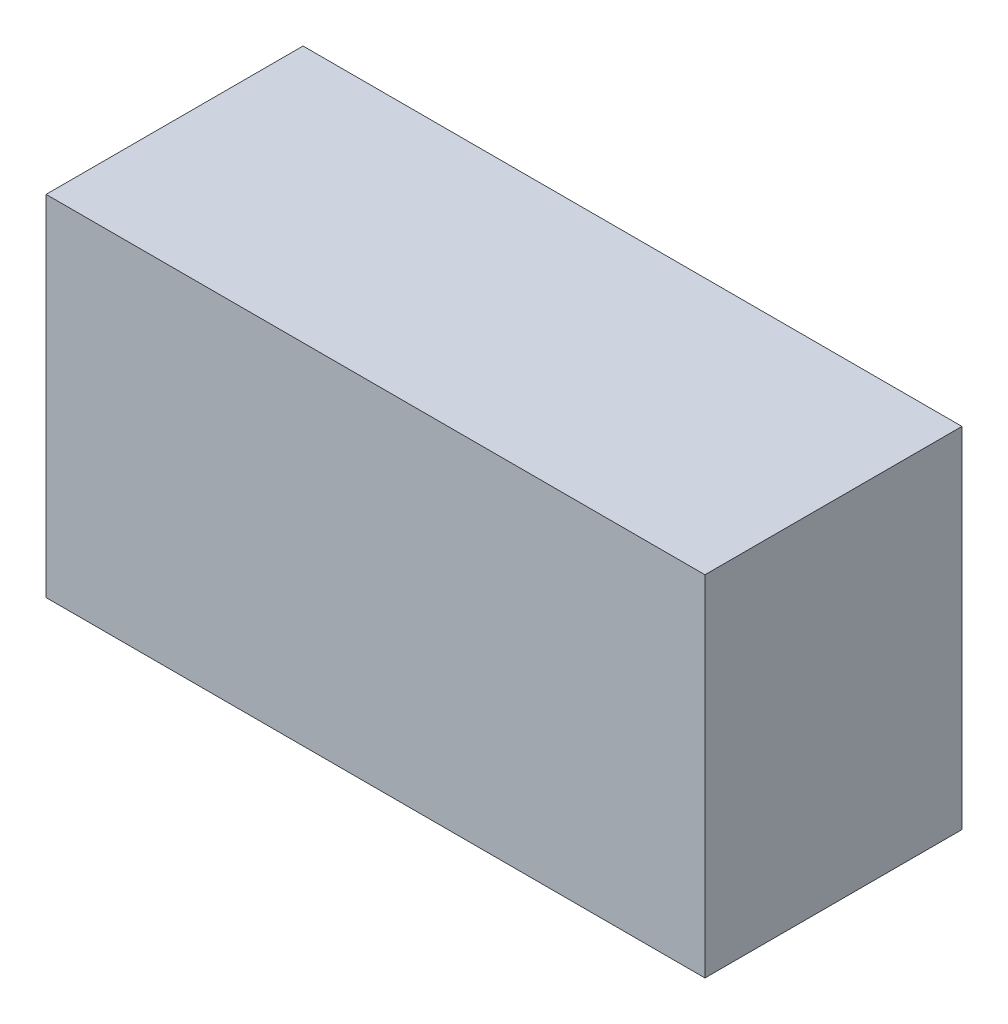
ISO-10303-21;
HEADER;
FILE_DESCRIPTION(('STEP AP214'),'2;1');
FILE_NAME('part.step','',(''),(''),'','','');
FILE_SCHEMA(('AUTOMOTIVE_DESIGN { 1 0 10303 214 1 1 1 1 }'));
ENDSEC;
DATA;
#1=APPLICATION_CONTEXT('core data for automotive mechanical design processes');
#2=APPLICATION_PROTOCOL_DEFINITION('international standard','automotive_design',2000,#1);
#3=PRODUCT_CONTEXT('',#1,'mechanical');
#4=PRODUCT('Part','Part','',(#3));
#5=PRODUCT_RELATED_PRODUCT_CATEGORY('part','',(#4));
#6=PRODUCT_DEFINITION_FORMATION('','',#4);
#7=PRODUCT_DEFINITION_CONTEXT('part definition',#1,'design');
#8=PRODUCT_DEFINITION('design','',#6,#7);
#9=PRODUCT_DEFINITION_SHAPE('','',#8);
#10=(LENGTH_UNIT() NAMED_UNIT(*) SI_UNIT(.MILLI.,.METRE.));
#11=(NAMED_UNIT(*) PLANE_ANGLE_UNIT() SI_UNIT($,.RADIAN.));
#12=(NAMED_UNIT(*) SI_UNIT($,.STERADIAN.) SOLID_ANGLE_UNIT());
#13=UNCERTAINTY_MEASURE_WITH_UNIT(LENGTH_MEASURE(1.E-05),#10,'distance_accuracy_value','');
#14=(GEOMETRIC_REPRESENTATION_CONTEXT(3) GLOBAL_UNCERTAINTY_ASSIGNED_CONTEXT((#13)) GLOBAL_UNIT_ASSIGNED_CONTEXT((#10,
#11,#12)) REPRESENTATION_CONTEXT('',''));
#15=CARTESIAN_POINT('',(0.,0.,0.));
#16=DIRECTION('',(0.,0.,1.));
#17=DIRECTION('',(1.,0.,0.));
#18=AXIS2_PLACEMENT_3D('',#15,#16,#17);
#19=CARTESIAN_POINT('',(0.,53.,0.));
#20=DIRECTION('',(1.,0.,0.));
#21=DIRECTION('',(0.,0.,-1.));
#22=AXIS2_PLACEMENT_3D('',#19,#20,#21);
#23=PLANE('',#22);
#24=DIRECTION('',(0.,0.,1.));
#25=VECTOR('',#24,1.);
#26=CARTESIAN_POINT('',(0.,0.,0.));
#27=LINE('',#26,#25);
#28=CARTESIAN_POINT('',(0.,0.,0.));
#29=VERTEX_POINT('',#28);
#30=CARTESIAN_POINT('',(0.,0.,39.));
#31=VERTEX_POINT('',#30);
#32=EDGE_CURVE('E104',#29,#31,#27,.T.);
#33=ORIENTED_EDGE('',*,*,#32,.T.);
#34=DIRECTION('',(0.,-1.,0.));
#35=VECTOR('',#34,1.);
#36=CARTESIAN_POINT('',(0.,53.,39.));
#37=LINE('',#36,#35);
#38=CARTESIAN_POINT('',(0.,53.,39.));
#39=VERTEX_POINT('',#38);
#40=EDGE_CURVE('E11',#39,#31,#37,.T.);
#41=ORIENTED_EDGE('',*,*,#40,.F.);
#42=DIRECTION('',(0.,0.,1.));
#43=VECTOR('',#42,1.);
#44=CARTESIAN_POINT('',(0.,53.,0.));
#45=LINE('',#44,#43);
#46=CARTESIAN_POINT('',(0.,53.,0.));
#47=VERTEX_POINT('',#46);
#48=EDGE_CURVE('E92',#47,#39,#45,.T.);
#49=ORIENTED_EDGE('',*,*,#48,.F.);
#50=DIRECTION('',(0.,-1.,0.));
#51=VECTOR('',#50,1.);
#52=CARTESIAN_POINT('',(0.,53.,0.));
#53=LINE('',#52,#51);
#54=EDGE_CURVE('E100',#47,#29,#53,.T.);
#55=ORIENTED_EDGE('',*,*,#54,.T.);
#56=EDGE_LOOP('',(#33,#41,#49,#55));
#57=FACE_BOUND('',#56,.T.);
#58=ADVANCED_FACE('F41',(#57),#23,.F.);
#59=CARTESIAN_POINT('',(0.,53.,39.));
#60=DIRECTION('',(0.,0.,-1.));
#61=DIRECTION('',(-1.,0.,0.));
#62=AXIS2_PLACEMENT_3D('',#59,#60,#61);
#63=PLANE('',#62);
#64=DIRECTION('',(1.,0.,0.));
#65=VECTOR('',#64,1.);
#66=CARTESIAN_POINT('',(0.,0.,39.));
#67=LINE('',#66,#65);
#68=CARTESIAN_POINT('',(100.,0.,39.));
#69=VERTEX_POINT('',#68);
#70=EDGE_CURVE('E96',#31,#69,#67,.T.);
#71=ORIENTED_EDGE('',*,*,#70,.T.);
#72=DIRECTION('',(0.,-1.,0.));
#73=VECTOR('',#72,1.);
#74=CARTESIAN_POINT('',(100.,53.,39.));
#75=LINE('',#74,#73);
#76=CARTESIAN_POINT('',(100.,53.,39.));
#77=VERTEX_POINT('',#76);
#78=EDGE_CURVE('E49',#77,#69,#75,.T.);
#79=ORIENTED_EDGE('',*,*,#78,.F.);
#80=DIRECTION('',(1.,0.,0.));
#81=VECTOR('',#80,1.);
#82=CARTESIAN_POINT('',(0.,53.,39.));
#83=LINE('',#82,#81);
#84=EDGE_CURVE('E87',#39,#77,#83,.T.);
#85=ORIENTED_EDGE('',*,*,#84,.F.);
#86=ORIENTED_EDGE('',*,*,#40,.T.);
#87=EDGE_LOOP('',(#71,#79,#85,#86));
#88=FACE_BOUND('',#87,.T.);
#89=ADVANCED_FACE('F95',(#88),#63,.F.);
#90=CARTESIAN_POINT('',(100.,53.,0.));
#91=DIRECTION('',(-1.,0.,0.));
#92=DIRECTION('',(0.,0.,1.));
#93=AXIS2_PLACEMENT_3D('',#90,#91,#92);
#94=PLANE('',#93);
#95=DIRECTION('',(0.,0.,-1.));
#96=VECTOR('',#95,1.);
#97=CARTESIAN_POINT('',(100.,0.,0.));
#98=LINE('',#97,#96);
#99=CARTESIAN_POINT('',(100.,0.,0.));
#100=VERTEX_POINT('',#99);
#101=EDGE_CURVE('E74',#69,#100,#98,.T.);
#102=ORIENTED_EDGE('',*,*,#101,.T.);
#103=DIRECTION('',(0.,-1.,0.));
#104=VECTOR('',#103,1.);
#105=CARTESIAN_POINT('',(100.,53.,0.));
#106=LINE('',#105,#104);
#107=CARTESIAN_POINT('',(100.,53.,0.));
#108=VERTEX_POINT('',#107);
#109=EDGE_CURVE('E97',#108,#100,#106,.T.);
#110=ORIENTED_EDGE('',*,*,#109,.F.);
#111=DIRECTION('',(0.,0.,-1.));
#112=VECTOR('',#111,1.);
#113=CARTESIAN_POINT('',(100.,53.,0.));
#114=LINE('',#113,#112);
#115=EDGE_CURVE('E90',#77,#108,#114,.T.);
#116=ORIENTED_EDGE('',*,*,#115,.F.);
#117=ORIENTED_EDGE('',*,*,#78,.T.);
#118=EDGE_LOOP('',(#102,#110,#116,#117));
#119=FACE_BOUND('',#118,.T.);
#120=ADVANCED_FACE('F98',(#119),#94,.F.);
#121=CARTESIAN_POINT('',(0.,53.,0.));
#122=DIRECTION('',(0.,0.,1.));
#123=DIRECTION('',(1.,0.,0.));
#124=AXIS2_PLACEMENT_3D('',#121,#122,#123);
#125=PLANE('',#124);
#126=DIRECTION('',(-1.,0.,0.));
#127=VECTOR('',#126,1.);
#128=CARTESIAN_POINT('',(0.,0.,0.));
#129=LINE('',#128,#127);
#130=EDGE_CURVE('E80',#100,#29,#129,.T.);
#131=ORIENTED_EDGE('',*,*,#130,.T.);
#132=ORIENTED_EDGE('',*,*,#54,.F.);
#133=DIRECTION('',(-1.,0.,0.));
#134=VECTOR('',#133,1.);
#135=CARTESIAN_POINT('',(0.,53.,0.));
#136=LINE('',#135,#134);
#137=EDGE_CURVE('E57',#108,#47,#136,.T.);
#138=ORIENTED_EDGE('',*,*,#137,.F.);
#139=ORIENTED_EDGE('',*,*,#109,.T.);
#140=EDGE_LOOP('',(#131,#132,#138,#139));
#141=FACE_BOUND('',#140,.T.);
#142=ADVANCED_FACE('F111',(#141),#125,.F.);
#143=CARTESIAN_POINT('',(0.,53.,0.));
#144=DIRECTION('',(0.,1.,0.));
#145=DIRECTION('',(0.,0.,1.));
#146=AXIS2_PLACEMENT_3D('',#143,#144,#145);
#147=PLANE('',#146);
#148=ORIENTED_EDGE('',*,*,#48,.T.);
#149=ORIENTED_EDGE('',*,*,#84,.T.);
#150=ORIENTED_EDGE('',*,*,#115,.T.);
#151=ORIENTED_EDGE('',*,*,#137,.T.);
#152=EDGE_LOOP('',(#148,#149,#150,#151));
#153=FACE_BOUND('',#152,.T.);
#154=ADVANCED_FACE('F88',(#153),#147,.T.);
#155=CARTESIAN_POINT('',(0.,0.,0.));
#156=DIRECTION('',(0.,1.,0.));
#157=DIRECTION('',(0.,0.,1.));
#158=AXIS2_PLACEMENT_3D('',#155,#156,#157);
#159=PLANE('',#158);
#160=ORIENTED_EDGE('',*,*,#32,.F.);
#161=ORIENTED_EDGE('',*,*,#130,.F.);
#162=ORIENTED_EDGE('',*,*,#101,.F.);
#163=ORIENTED_EDGE('',*,*,#70,.F.);
#164=EDGE_LOOP('',(#160,#161,#162,#163));
#165=FACE_BOUND('',#164,.T.);
#166=ADVANCED_FACE('F114',(#165),#159,.F.);
#167=CLOSED_SHELL('',(#58,#89,#120,#142,#154,#166));
#168=MANIFOLD_SOLID_BREP('B2',#167);
#169=ADVANCED_BREP_SHAPE_REPRESENTATION('',(#18,#168),#14);
#170=SHAPE_DEFINITION_REPRESENTATION(#9,#169);
ENDSEC;
END-ISO-10303-21;
